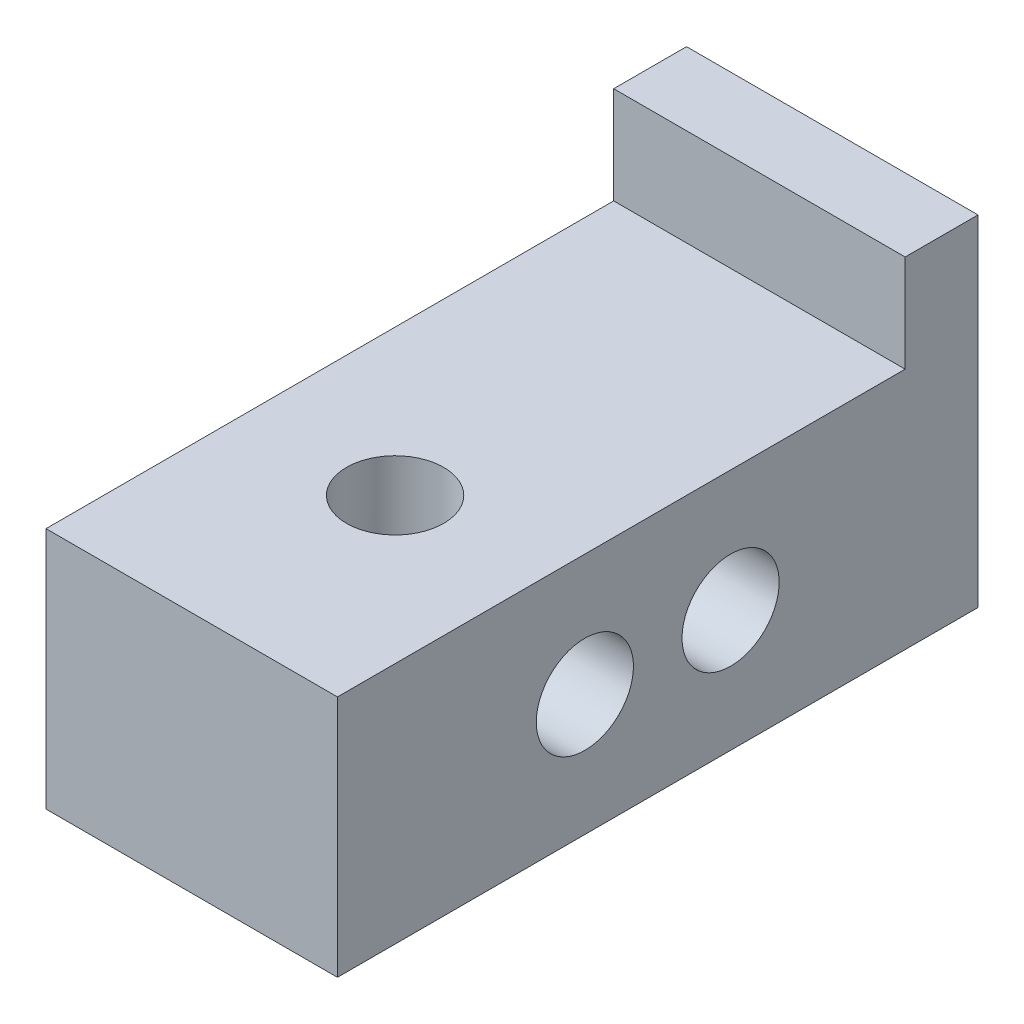
ISO-10303-21;
HEADER;
FILE_DESCRIPTION(('STEP AP214'),'2;1');
FILE_NAME('part.step','',(''),(''),'','','');
FILE_SCHEMA(('AUTOMOTIVE_DESIGN { 1 0 10303 214 1 1 1 1 }'));
ENDSEC;
DATA;
#1=APPLICATION_CONTEXT('core data for automotive mechanical design processes');
#2=APPLICATION_PROTOCOL_DEFINITION('international standard','automotive_design',2000,#1);
#3=PRODUCT_CONTEXT('',#1,'mechanical');
#4=PRODUCT('Part','Part','',(#3));
#5=PRODUCT_RELATED_PRODUCT_CATEGORY('part','',(#4));
#6=PRODUCT_DEFINITION_FORMATION('','',#4);
#7=PRODUCT_DEFINITION_CONTEXT('part definition',#1,'design');
#8=PRODUCT_DEFINITION('design','',#6,#7);
#9=PRODUCT_DEFINITION_SHAPE('','',#8);
#10=(LENGTH_UNIT() NAMED_UNIT(*) SI_UNIT(.MILLI.,.METRE.));
#11=(NAMED_UNIT(*) PLANE_ANGLE_UNIT() SI_UNIT($,.RADIAN.));
#12=(NAMED_UNIT(*) SI_UNIT($,.STERADIAN.) SOLID_ANGLE_UNIT());
#13=UNCERTAINTY_MEASURE_WITH_UNIT(LENGTH_MEASURE(1.E-05),#10,'distance_accuracy_value','');
#14=(GEOMETRIC_REPRESENTATION_CONTEXT(3) GLOBAL_UNCERTAINTY_ASSIGNED_CONTEXT((#13)) GLOBAL_UNIT_ASSIGNED_CONTEXT((#10,
#11,#12)) REPRESENTATION_CONTEXT('',''));
#15=CARTESIAN_POINT('',(0.,0.,0.));
#16=DIRECTION('',(0.,0.,1.));
#17=DIRECTION('',(1.,0.,0.));
#18=AXIS2_PLACEMENT_3D('',#15,#16,#17);
#19=CARTESIAN_POINT('',(0.,10.,0.));
#20=DIRECTION('',(0.,-1.,0.));
#21=DIRECTION('',(0.,0.,-1.));
#22=AXIS2_PLACEMENT_3D('',#19,#20,#21);
#23=PLANE('',#22);
#24=DIRECTION('',(0.,0.,-1.));
#25=VECTOR('',#24,1.);
#26=CARTESIAN_POINT('',(6.00000000000001,10.,8.37336111566911));
#27=LINE('',#26,#25);
#28=CARTESIAN_POINT('',(6.00000000000001,10.,8.37336111566911));
#29=VERTEX_POINT('',#28);
#30=CARTESIAN_POINT('',(6.00000000000001,10.,-15.));
#31=VERTEX_POINT('',#30);
#32=EDGE_CURVE('E108',#29,#31,#27,.T.);
#33=ORIENTED_EDGE('',*,*,#32,.T.);
#34=DIRECTION('',(-1.,0.,0.));
#35=VECTOR('',#34,1.);
#36=CARTESIAN_POINT('',(-6.,10.,-15.));
#37=LINE('',#36,#35);
#38=CARTESIAN_POINT('',(-6.,10.,-15.));
#39=VERTEX_POINT('',#38);
#40=EDGE_CURVE('E85',#31,#39,#37,.T.);
#41=ORIENTED_EDGE('',*,*,#40,.T.);
#42=DIRECTION('',(0.,0.,1.));
#43=VECTOR('',#42,1.);
#44=CARTESIAN_POINT('',(-6.,10.,-15.));
#45=LINE('',#44,#43);
#46=CARTESIAN_POINT('',(-6.,10.,8.37336111566911));
#47=VERTEX_POINT('',#46);
#48=EDGE_CURVE('E106',#39,#47,#45,.T.);
#49=ORIENTED_EDGE('',*,*,#48,.T.);
#50=DIRECTION('',(1.,0.,0.));
#51=VECTOR('',#50,1.);
#52=CARTESIAN_POINT('',(-6.,10.,8.37336111566911));
#53=LINE('',#52,#51);
#54=EDGE_CURVE('E64',#47,#29,#53,.T.);
#55=ORIENTED_EDGE('',*,*,#54,.T.);
#56=EDGE_LOOP('',(#33,#41,#49,#55));
#57=FACE_BOUND('',#56,.T.);
#58=CARTESIAN_POINT('',(0.,10.,0.));
#59=DIRECTION('',(0.,1.,0.));
#60=DIRECTION('',(0.,0.,1.));
#61=AXIS2_PLACEMENT_3D('',#58,#59,#60);
#62=CIRCLE('',#61,2.);
#63=CARTESIAN_POINT('',(0.,10.,2.));
#64=VERTEX_POINT('',#63);
#65=EDGE_CURVE('E122',#64,#64,#62,.T.);
#66=ORIENTED_EDGE('',*,*,#65,.F.);
#67=EDGE_LOOP('',(#66));
#68=FACE_BOUND('',#67,.T.);
#69=ADVANCED_FACE('F40',(#57,#68),#23,.F.);
#70=CARTESIAN_POINT('',(0.,0.,0.));
#71=DIRECTION('',(0.,-1.,0.));
#72=DIRECTION('',(0.,0.,-1.));
#73=AXIS2_PLACEMENT_3D('',#70,#71,#72);
#74=PLANE('',#73);
#75=DIRECTION('',(0.,0.,-1.));
#76=VECTOR('',#75,1.);
#77=CARTESIAN_POINT('',(6.00000000000001,0.,8.37336111566911));
#78=LINE('',#77,#76);
#79=CARTESIAN_POINT('',(6.00000000000001,0.,8.37336111566911));
#80=VERTEX_POINT('',#79);
#81=CARTESIAN_POINT('',(6.00000000000001,0.,-18.));
#82=VERTEX_POINT('',#81);
#83=EDGE_CURVE('E118',#80,#82,#78,.T.);
#84=ORIENTED_EDGE('',*,*,#83,.F.);
#85=DIRECTION('',(1.,0.,0.));
#86=VECTOR('',#85,1.);
#87=CARTESIAN_POINT('',(-6.,0.,8.37336111566911));
#88=LINE('',#87,#86);
#89=CARTESIAN_POINT('',(-6.,0.,8.37336111566911));
#90=VERTEX_POINT('',#89);
#91=EDGE_CURVE('E125',#90,#80,#88,.T.);
#92=ORIENTED_EDGE('',*,*,#91,.F.);
#93=DIRECTION('',(0.,0.,1.));
#94=VECTOR('',#93,1.);
#95=CARTESIAN_POINT('',(-6.,0.,-15.));
#96=LINE('',#95,#94);
#97=CARTESIAN_POINT('',(-6.,0.,-18.));
#98=VERTEX_POINT('',#97);
#99=EDGE_CURVE('E76',#98,#90,#96,.T.);
#100=ORIENTED_EDGE('',*,*,#99,.F.);
#101=DIRECTION('',(-1.,0.,0.));
#102=VECTOR('',#101,1.);
#103=CARTESIAN_POINT('',(-6.,0.,-18.));
#104=LINE('',#103,#102);
#105=EDGE_CURVE('E142',#82,#98,#104,.T.);
#106=ORIENTED_EDGE('',*,*,#105,.F.);
#107=EDGE_LOOP('',(#84,#92,#100,#106));
#108=FACE_BOUND('',#107,.T.);
#109=CARTESIAN_POINT('',(0.,0.,0.));
#110=DIRECTION('',(0.,1.,0.));
#111=DIRECTION('',(0.,0.,1.));
#112=AXIS2_PLACEMENT_3D('',#109,#110,#111);
#113=CIRCLE('',#112,2.);
#114=CARTESIAN_POINT('',(0.,0.,2.));
#115=VERTEX_POINT('',#114);
#116=EDGE_CURVE('E102',#115,#115,#113,.T.);
#117=ORIENTED_EDGE('',*,*,#116,.T.);
#118=EDGE_LOOP('',(#117));
#119=FACE_BOUND('',#118,.T.);
#120=ADVANCED_FACE('F139',(#108,#119),#74,.T.);
#121=CARTESIAN_POINT('',(6.00000000000001,10.,8.37336111566911));
#122=DIRECTION('',(-1.,0.,0.));
#123=DIRECTION('',(0.,0.,1.));
#124=AXIS2_PLACEMENT_3D('',#121,#122,#123);
#125=PLANE('',#124);
#126=CARTESIAN_POINT('',(6.,5.,-7.81331944216545));
#127=DIRECTION('',(-1.,0.,0.));
#128=DIRECTION('',(0.,0.,1.));
#129=AXIS2_PLACEMENT_3D('',#126,#127,#128);
#130=CIRCLE('',#129,2.);
#131=CARTESIAN_POINT('',(6.,5.,-5.81331944216545));
#132=VERTEX_POINT('',#131);
#133=EDGE_CURVE('E149',#132,#132,#130,.T.);
#134=ORIENTED_EDGE('',*,*,#133,.T.);
#135=EDGE_LOOP('',(#134));
#136=FACE_BOUND('',#135,.T.);
#137=CARTESIAN_POINT('',(6.,5.,-1.81331944216545));
#138=DIRECTION('',(-1.,0.,0.));
#139=DIRECTION('',(0.,0.,1.));
#140=AXIS2_PLACEMENT_3D('',#137,#138,#139);
#141=CIRCLE('',#140,2.);
#142=CARTESIAN_POINT('',(6.,5.,0.186680557834554));
#143=VERTEX_POINT('',#142);
#144=EDGE_CURVE('E155',#143,#143,#141,.T.);
#145=ORIENTED_EDGE('',*,*,#144,.T.);
#146=EDGE_LOOP('',(#145));
#147=FACE_BOUND('',#146,.T.);
#148=ORIENTED_EDGE('',*,*,#83,.T.);
#149=DIRECTION('',(0.,-1.,0.));
#150=VECTOR('',#149,1.);
#151=CARTESIAN_POINT('',(6.00000000000001,14.,-18.));
#152=LINE('',#151,#150);
#153=CARTESIAN_POINT('',(6.00000000000001,14.,-18.));
#154=VERTEX_POINT('',#153);
#155=EDGE_CURVE('E171',#154,#82,#152,.T.);
#156=ORIENTED_EDGE('',*,*,#155,.F.);
#157=DIRECTION('',(0.,0.,-1.));
#158=VECTOR('',#157,1.);
#159=CARTESIAN_POINT('',(6.00000000000001,14.,-15.));
#160=LINE('',#159,#158);
#161=CARTESIAN_POINT('',(6.00000000000001,14.,-15.));
#162=VERTEX_POINT('',#161);
#163=EDGE_CURVE('E161',#162,#154,#160,.T.);
#164=ORIENTED_EDGE('',*,*,#163,.F.);
#165=DIRECTION('',(0.,-1.,0.));
#166=VECTOR('',#165,1.);
#167=CARTESIAN_POINT('',(6.00000000000001,14.,-15.));
#168=LINE('',#167,#166);
#169=EDGE_CURVE('E103',#162,#31,#168,.T.);
#170=ORIENTED_EDGE('',*,*,#169,.T.);
#171=ORIENTED_EDGE('',*,*,#32,.F.);
#172=DIRECTION('',(0.,-1.,0.));
#173=VECTOR('',#172,1.);
#174=CARTESIAN_POINT('',(6.00000000000001,10.,8.37336111566911));
#175=LINE('',#174,#173);
#176=EDGE_CURVE('E56',#29,#80,#175,.T.);
#177=ORIENTED_EDGE('',*,*,#176,.T.);
#178=EDGE_LOOP('',(#148,#156,#164,#170,#171,#177));
#179=FACE_BOUND('',#178,.T.);
#180=ADVANCED_FACE('F42',(#136,#147,#179),#125,.F.);
#181=CARTESIAN_POINT('',(-6.,10.,-15.));
#182=DIRECTION('',(1.,0.,0.));
#183=DIRECTION('',(0.,0.,-1.));
#184=AXIS2_PLACEMENT_3D('',#181,#182,#183);
#185=PLANE('',#184);
#186=CARTESIAN_POINT('',(-6.,5.,-7.81331944216545));
#187=DIRECTION('',(-1.,0.,0.));
#188=DIRECTION('',(0.,0.,1.));
#189=AXIS2_PLACEMENT_3D('',#186,#187,#188);
#190=CIRCLE('',#189,2.);
#191=CARTESIAN_POINT('',(-6.,5.,-5.81331944216544));
#192=VERTEX_POINT('',#191);
#193=EDGE_CURVE('E214',#192,#192,#190,.T.);
#194=ORIENTED_EDGE('',*,*,#193,.F.);
#195=EDGE_LOOP('',(#194));
#196=FACE_BOUND('',#195,.T.);
#197=CARTESIAN_POINT('',(-6.,5.,-1.81331944216545));
#198=DIRECTION('',(-1.,0.,0.));
#199=DIRECTION('',(0.,0.,1.));
#200=AXIS2_PLACEMENT_3D('',#197,#198,#199);
#201=CIRCLE('',#200,2.);
#202=CARTESIAN_POINT('',(-6.,5.,0.186680557834556));
#203=VERTEX_POINT('',#202);
#204=EDGE_CURVE('E217',#203,#203,#201,.T.);
#205=ORIENTED_EDGE('',*,*,#204,.F.);
#206=EDGE_LOOP('',(#205));
#207=FACE_BOUND('',#206,.T.);
#208=ORIENTED_EDGE('',*,*,#99,.T.);
#209=DIRECTION('',(0.,-1.,0.));
#210=VECTOR('',#209,1.);
#211=CARTESIAN_POINT('',(-6.,10.,8.37336111566911));
#212=LINE('',#211,#210);
#213=EDGE_CURVE('E11',#47,#90,#212,.T.);
#214=ORIENTED_EDGE('',*,*,#213,.F.);
#215=ORIENTED_EDGE('',*,*,#48,.F.);
#216=DIRECTION('',(0.,-1.,0.));
#217=VECTOR('',#216,1.);
#218=CARTESIAN_POINT('',(-6.,14.,-15.));
#219=LINE('',#218,#217);
#220=CARTESIAN_POINT('',(-6.,14.,-15.));
#221=VERTEX_POINT('',#220);
#222=EDGE_CURVE('E93',#221,#39,#219,.T.);
#223=ORIENTED_EDGE('',*,*,#222,.F.);
#224=DIRECTION('',(0.,0.,1.));
#225=VECTOR('',#224,1.);
#226=CARTESIAN_POINT('',(-6.,14.,-15.));
#227=LINE('',#226,#225);
#228=CARTESIAN_POINT('',(-6.,14.,-18.));
#229=VERTEX_POINT('',#228);
#230=EDGE_CURVE('E148',#229,#221,#227,.T.);
#231=ORIENTED_EDGE('',*,*,#230,.F.);
#232=DIRECTION('',(0.,-1.,0.));
#233=VECTOR('',#232,1.);
#234=CARTESIAN_POINT('',(-6.,14.,-18.));
#235=LINE('',#234,#233);
#236=EDGE_CURVE('E168',#229,#98,#235,.T.);
#237=ORIENTED_EDGE('',*,*,#236,.T.);
#238=EDGE_LOOP('',(#208,#214,#215,#223,#231,#237));
#239=FACE_BOUND('',#238,.T.);
#240=ADVANCED_FACE('F111',(#196,#207,#239),#185,.F.);
#241=CARTESIAN_POINT('',(-6.,10.,8.37336111566911));
#242=DIRECTION('',(0.,0.,-1.));
#243=DIRECTION('',(-1.,0.,0.));
#244=AXIS2_PLACEMENT_3D('',#241,#242,#243);
#245=PLANE('',#244);
#246=ORIENTED_EDGE('',*,*,#91,.T.);
#247=ORIENTED_EDGE('',*,*,#176,.F.);
#248=ORIENTED_EDGE('',*,*,#54,.F.);
#249=ORIENTED_EDGE('',*,*,#213,.T.);
#250=EDGE_LOOP('',(#246,#247,#248,#249));
#251=FACE_BOUND('',#250,.T.);
#252=ADVANCED_FACE('F186',(#251),#245,.F.);
#253=CARTESIAN_POINT('',(0.,10.,0.));
#254=DIRECTION('',(0.,-1.,0.));
#255=DIRECTION('',(0.,0.,-1.));
#256=AXIS2_PLACEMENT_3D('',#253,#254,#255);
#257=CYLINDRICAL_SURFACE('',#256,2.);
#258=CARTESIAN_POINT('',(0.,6.99126853270135,-2.));
#259=CARTESIAN_POINT('',(-0.112143229086386,6.99126942308835,-1.99999934005024));
#260=CARTESIAN_POINT('',(-0.224291314512654,6.99222343560448,-1.99054496028743));
#261=CARTESIAN_POINT('',(-0.445439379954963,6.99520398681138,-1.95298908898448));
#262=CARTESIAN_POINT('',(-0.554438326887592,6.99723087334127,-1.92488154910743));
#263=CARTESIAN_POINT('',(-0.766266435904901,6.99999160623168,-1.85079573427145));
#264=CARTESIAN_POINT('',(-0.869091784540033,7.00072466116739,-1.80480654224218));
#265=CARTESIAN_POINT('',(-1.06561460225727,6.99730130861139,-1.69618063267274));
#266=CARTESIAN_POINT('',(-1.15931228994161,6.99314501824789,-1.63354431395571));
#267=CARTESIAN_POINT('',(-1.28939613321082,6.98010466330255,-1.52985198640311));
#268=CARTESIAN_POINT('',(-1.33053881254709,6.97473650065371,-1.49419377988196));
#269=CARTESIAN_POINT('',(-1.40954636623935,6.96128651657752,-1.41989839802572));
#270=CARTESIAN_POINT('',(-1.44741311648559,6.9532062612824,-1.38126295183266));
#271=CARTESIAN_POINT('',(-1.51949331728818,6.93384736513408,-1.30154643758386));
#272=CARTESIAN_POINT('',(-1.55371121354777,6.92257267904738,-1.26046844282697));
#273=CARTESIAN_POINT('',(-1.61824893760184,6.89640791425496,-1.17646996368034));
#274=CARTESIAN_POINT('',(-1.64856953704912,6.88151855293555,-1.13354984627703));
#275=CARTESIAN_POINT('',(-1.72550113948489,6.83558602615675,-1.01517323687524));
#276=CARTESIAN_POINT('',(-1.76811543481115,6.80063223518841,-0.938548471080379));
#277=CARTESIAN_POINT('',(-1.84094589521428,6.7182771921645,-0.78617652398999));
#278=CARTESIAN_POINT('',(-1.87116388326075,6.67087777201427,-0.710429215251065));
#279=CARTESIAN_POINT('',(-1.91842045098874,6.56865928163556,-0.569839569740616));
#280=CARTESIAN_POINT('',(-1.9363351363286,6.51476471590773,-0.504612090534075));
#281=CARTESIAN_POINT('',(-1.96445811490352,6.39817783716925,-0.380719498585895));
#282=CARTESIAN_POINT('',(-1.97466415726142,6.33548296085312,-0.322056306832658));
#283=CARTESIAN_POINT('',(-1.99002654164323,6.19689518997848,-0.20827557835165));
#284=CARTESIAN_POINT('',(-1.99466546821938,6.12032832397824,-0.153912232433168));
#285=CARTESIAN_POINT('',(-1.99980179077285,5.96022777211619,-0.0564002113243095));
#286=CARTESIAN_POINT('',(-2.00029671884074,5.87668996469367,-0.0132582337021736));
#287=CARTESIAN_POINT('',(-1.99935868726461,5.69238240154821,0.0660459454856754));
#288=CARTESIAN_POINT('',(-1.99764786181885,5.59083238933384,0.100401408154512));
#289=CARTESIAN_POINT('',(-1.99435132230936,5.38355036488834,0.152467182806228));
#290=CARTESIAN_POINT('',(-1.99276562862074,5.27781767578627,0.170174789135334));
#291=CARTESIAN_POINT('',(-1.99108036285,5.05937302186599,0.188952461597324));
#292=CARTESIAN_POINT('',(-1.99106128852216,4.94658147949519,0.189121451027664));
#293=CARTESIAN_POINT('',(-1.99273692259282,4.72257104825898,0.170533677008231));
#294=CARTESIAN_POINT('',(-1.99443197919848,4.61135248358157,0.151773068217112));
#295=CARTESIAN_POINT('',(-1.99789229958984,4.39384621228331,0.0959099786426279));
#296=CARTESIAN_POINT('',(-1.99965742212992,4.28754943671877,0.0588428312204764));
#297=CARTESIAN_POINT('',(-2.00025642220061,4.08261081368761,-0.0325893823976385));
#298=CARTESIAN_POINT('',(-1.99908932119186,3.98397153299823,-0.0869602178791545));
#299=CARTESIAN_POINT('',(-1.98980372275692,3.79806297628228,-0.210920542965283));
#300=CARTESIAN_POINT('',(-1.98174069939682,3.71070935076797,-0.280385292440097));
#301=CARTESIAN_POINT('',(-1.96121947516926,3.59000796903327,-0.393816405360437));
#302=CARTESIAN_POINT('',(-1.95297639165697,3.55150043115326,-0.433159517351158));
#303=CARTESIAN_POINT('',(-1.93316959533721,3.47822438407291,-0.51440017318011));
#304=CARTESIAN_POINT('',(-1.92160650796086,3.44345517233083,-0.556297234728692));
#305=CARTESIAN_POINT('',(-1.88440146349238,3.35299389249959,-0.674738617048756));
#306=CARTESIAN_POINT('',(-1.85474436758304,3.3015373854818,-0.753365756880023));
#307=CARTESIAN_POINT('',(-1.78205667474408,3.21224911605061,-0.91207058205304));
#308=CARTESIAN_POINT('',(-1.73903435199076,3.17440895519385,-0.99214734115591));
#309=CARTESIAN_POINT('',(-1.64546550748009,3.11532957944772,-1.13981734950308));
#310=CARTESIAN_POINT('',(-1.59637790175452,3.09267062419304,-1.2077786552308));
#311=CARTESIAN_POINT('',(-1.48868909472764,3.05605375959673,-1.33826958257073));
#312=CARTESIAN_POINT('',(-1.43008517406994,3.04209834288891,-1.40079764373016));
#313=CARTESIAN_POINT('',(-1.30160078776846,3.02045938850253,-1.52117259864821));
#314=CARTESIAN_POINT('',(-1.23130714729948,3.01311852455976,-1.57863737281421));
#315=CARTESIAN_POINT('',(-1.08334678740809,3.00351202793137,-1.68362827802946));
#316=CARTESIAN_POINT('',(-1.00567620990882,3.00124906635115,-1.73114916643155));
#317=CARTESIAN_POINT('',(-0.833094041548664,2.99943628799276,-1.82118660993606));
#318=CARTESIAN_POINT('',(-0.737301809526328,3.00031836196478,-1.8620288565727));
#319=CARTESIAN_POINT('',(-0.540549462251195,3.00303506151183,-1.92836639121723));
#320=CARTESIAN_POINT('',(-0.439587626403302,3.00487000611215,-1.95385653309569));
#321=CARTESIAN_POINT('',(-0.22682807690269,3.00774738061693,-1.99024733107834));
#322=CARTESIAN_POINT('',(-0.114802900875644,3.00871607562856,-1.99984193539623));
#323=CARTESIAN_POINT('',(0.109272388732855,3.0087465005827,-2.0001542413599));
#324=CARTESIAN_POINT('',(0.221322503501561,3.00780809895759,-1.99087064062786));
#325=CARTESIAN_POINT('',(0.442309868722156,3.00484653611863,-1.95369423731902));
#326=CARTESIAN_POINT('',(0.551246115610802,3.00282302924892,-1.92579550427534));
#327=CARTESIAN_POINT('',(0.76299266737637,3.00003922789283,-1.8521373197849));
#328=CARTESIAN_POINT('',(0.865799927180175,2.9992795563589,-1.80636907405653));
#329=CARTESIAN_POINT('',(1.06247773384838,3.00258463797968,-1.69816303274679));
#330=CARTESIAN_POINT('',(1.15633018986018,3.00665894291658,-1.63569242303538));
#331=CARTESIAN_POINT('',(1.33168990675237,3.02403571668867,-1.49636059293474));
#332=CARTESIAN_POINT('',(1.41321158976887,3.03732730167637,-1.4195164230461));
#333=CARTESIAN_POINT('',(1.55438628378654,3.07579300091699,-1.26254577599915));
#334=CARTESIAN_POINT('',(1.61533547133934,3.09981275145818,-1.18331005327784));
#335=CARTESIAN_POINT('',(1.72274217034047,3.16175783059254,-1.02060412679572));
#336=CARTESIAN_POINT('',(1.76921660880176,3.19966680308167,-0.937139002843473));
#337=CARTESIAN_POINT('',(1.84208317240704,3.28391638626736,-0.782937901814216));
#338=CARTESIAN_POINT('',(1.87036700160128,3.3283573301852,-0.712042573157596));
#339=CARTESIAN_POINT('',(1.91711349913346,3.42763514092549,-0.574422139998956));
#340=CARTESIAN_POINT('',(1.93557357223804,3.4824747496758,-0.507698141580695));
#341=CARTESIAN_POINT('',(1.96450907430664,3.60164467086497,-0.380758726628646));
#342=CARTESIAN_POINT('',(1.97494119148954,3.6660242602618,-0.32058009869103));
#343=CARTESIAN_POINT('',(1.98985077371978,3.80256326836846,-0.208971297490543));
#344=CARTESIAN_POINT('',(1.994325724364,3.87472595828949,-0.15754482632337));
#345=CARTESIAN_POINT('',(1.99984576646172,4.03545130137926,-0.0584077073827951));
#346=CARTESIAN_POINT('',(2.00034888032685,4.12491449766772,-0.0121260518690867));
#347=CARTESIAN_POINT('',(1.99928165406809,4.3097715391063,0.0664914068528636));
#348=CARTESIAN_POINT('',(1.99771028642188,4.40516830093451,0.0988202885123696));
#349=CARTESIAN_POINT('',(1.99445564259909,4.60999637083108,0.151422110759208));
#350=CARTESIAN_POINT('',(1.99277795376315,4.71984918793823,0.170071593364329));
#351=CARTESIAN_POINT('',(1.99108219855859,4.94113037366704,0.188896771196589));
#352=CARTESIAN_POINT('',(1.99106414264122,5.05255875220611,0.189072350087456));
#353=CARTESIAN_POINT('',(1.99270957682578,5.2750070954947,0.170853921899788));
#354=CARTESIAN_POINT('',(1.99438993288609,5.38601175683231,0.152273663697219));
#355=CARTESIAN_POINT('',(1.99784811541726,5.60337612097276,0.0967953413075789));
#356=CARTESIAN_POINT('',(1.99962598805628,5.70973358004288,0.0598885328510098));
#357=CARTESIAN_POINT('',(2.00027293033851,5.91520648455933,-0.0314529020115355));
#358=CARTESIAN_POINT('',(1.99913199799608,6.01429582803908,-0.0859472375438565));
#359=CARTESIAN_POINT('',(1.99218161552959,6.15475569780335,-0.179391401620958));
#360=CARTESIAN_POINT('',(1.98898928576881,6.20023017049522,-0.212505792599706));
#361=CARTESIAN_POINT('',(1.98028641391631,6.28808918067541,-0.282317832868189));
#362=CARTESIAN_POINT('',(1.97477724748032,6.33047553428621,-0.319013345901255));
#363=CARTESIAN_POINT('',(1.96126152715075,6.40952233624607,-0.393449661236913));
#364=CARTESIAN_POINT('',(1.95341022723537,6.44636990599871,-0.43101994623053));
#365=CARTESIAN_POINT('',(1.93468605680219,6.51663855715915,-0.508505086928383));
#366=CARTESIAN_POINT('',(1.92381498473593,6.55006166186905,-0.548418536016941));
#367=CARTESIAN_POINT('',(1.89866176058137,6.61319928566318,-0.630000549054835));
#368=CARTESIAN_POINT('',(1.88438334997467,6.64291781849739,-0.67166714688236));
#369=CARTESIAN_POINT('',(1.85212116344705,6.69848700177853,-0.756105250995548));
#370=CARTESIAN_POINT('',(1.83413802672765,6.72433831813614,-0.798876565564987));
#371=CARTESIAN_POINT('',(1.78015561197954,6.78894853432315,-0.915174446455055));
#372=CARTESIAN_POINT('',(1.74039572272263,6.82394987466102,-0.989114186556959));
#373=CARTESIAN_POINT('',(1.6494675964774,6.88283744614802,-1.13428560629056));
#374=CARTESIAN_POINT('',(1.59829774095205,6.90672209887706,-1.20551690004159));
#375=CARTESIAN_POINT('',(1.48783967060337,6.94419084744194,-1.33923615121773));
#376=CARTESIAN_POINT('',(1.42896220060226,6.95815158668132,-1.40196089431337));
#377=CARTESIAN_POINT('',(1.30296504253528,6.97924853581636,-1.51978063176156));
#378=CARTESIAN_POINT('',(1.23584266684691,6.98638251367025,-1.57487312568267));
#379=CARTESIAN_POINT('',(1.08664418118737,6.99647928180636,-1.6818360770285));
#380=CARTESIAN_POINT('',(1.00373635753519,6.99886499036407,-1.73259905647663));
#381=CARTESIAN_POINT('',(0.831404849762716,7.00047882634889,-1.82158956657505));
#382=CARTESIAN_POINT('',(0.741977157767441,6.99970499520239,-1.85980930590817));
#383=CARTESIAN_POINT('',(0.545872217658506,6.99708079135959,-1.9272237645459));
#384=CARTESIAN_POINT('',(0.438514918725363,6.99509690458446,-1.9544522396439));
#385=CARTESIAN_POINT('',(0.220773390992123,6.99219031703259,-1.99084102259003));
#386=CARTESIAN_POINT('',(0.110389048295688,6.99126765624207,-2.00000064962662));
#387=CARTESIAN_POINT('',(0.,6.99126853270135,-2.));
#388=B_SPLINE_CURVE_WITH_KNOTS('',3,(#258,#259,#260,#261,#262,#263,#264,#265,#266,#267,#268,
#269,#270,#271,#272,#273,#274,#275,#276,#277,#278,#279,#280,#281,#282,#283,#284,#285,#286,#287,
#288,#289,#290,#291,#292,#293,#294,#295,#296,#297,#298,#299,#300,#301,#302,#303,#304,#305,#306,
#307,#308,#309,#310,#311,#312,#313,#314,#315,#316,#317,#318,#319,#320,#321,#322,#323,#324,#325,
#326,#327,#328,#329,#330,#331,#332,#333,#334,#335,#336,#337,#338,#339,#340,#341,#342,#343,#344,
#345,#346,#347,#348,#349,#350,#351,#352,#353,#354,#355,#356,#357,#358,#359,#360,#361,#362,#363,
#364,#365,#366,#367,#368,#369,#370,#371,#372,#373,#374,#375,#376,#377,#378,#379,#380,#381,#382,
#383,#384,#385,#386,#387),.UNSPECIFIED.,.T.,.F.,(4,2,2,2,2,2,2,2,2,2,2,2,2,2,2,2,2,2,2,2,2,2,2,
2,2,2,2,2,2,2,2,2,2,2,2,2,2,2,2,2,2,2,2,2,2,2,2,2,2,2,2,2,2,2,2,2,2,2,2,2,2,2,2,2,4),(0.,
0.33604418995549,0.672197396409887,1.00855615350453,1.3449068530184,1.50883134328893,
1.67266133568127,1.83628938307465,1.99988498254711,2.28131482096996,2.56270325818353,
2.82106640340939,3.07950495997899,3.36045954546821,3.64158143825432,3.9618237658057,
4.28211813099698,4.61886043094261,4.95567115018697,5.29183431839399,5.62810968561311,
5.9617050683558,6.12845529456007,6.29517412850192,6.58888196947034,6.88240834222952,
7.14176503992664,7.40119598153711,7.67340165631109,7.94575048463896,8.25685348684963,
8.56806071493584,8.90375963766444,9.23948172052217,9.57531080986755,9.91130538250895,
10.2479649768386,10.5842277158775,10.8907629330978,11.196938325186,11.4606323659069,
11.7243960346054,11.9895729523616,12.2548617606423,12.5558152263064,12.8569178147533,
13.1896546793646,13.5223936393297,13.8584696219583,14.1947061130723,14.532096341387,
14.7009292006399,14.8696619541321,15.0290474451691,15.1883382155594,15.3474548726036,
15.5065440991299,15.7778496947447,16.0491938003613,16.3095923122906,16.570075933679,
16.8606517029263,17.1514076251291,17.4821828398288,17.8129705174861),.UNSPECIFIED.);
#389=CARTESIAN_POINT('',(0.,6.99126853270135,-2.));
#390=VERTEX_POINT('',#389);
#391=EDGE_CURVE('E44',#390,#390,#388,.T.);
#392=ORIENTED_EDGE('',*,*,#391,.F.);
#393=EDGE_LOOP('',(#392));
#394=FACE_BOUND('',#393,.T.);
#395=ORIENTED_EDGE('',*,*,#65,.T.);
#396=EDGE_LOOP('',(#395));
#397=FACE_BOUND('',#396,.T.);
#398=ORIENTED_EDGE('',*,*,#116,.F.);
#399=EDGE_LOOP('',(#398));
#400=FACE_BOUND('',#399,.T.);
#401=ADVANCED_FACE('F184',(#394,#397,#400),#257,.F.);
#402=CARTESIAN_POINT('',(-6.,14.,-15.));
#403=DIRECTION('',(0.,0.,-1.));
#404=DIRECTION('',(-1.,0.,0.));
#405=AXIS2_PLACEMENT_3D('',#402,#403,#404);
#406=PLANE('',#405);
#407=ORIENTED_EDGE('',*,*,#40,.F.);
#408=ORIENTED_EDGE('',*,*,#169,.F.);
#409=DIRECTION('',(1.,0.,0.));
#410=VECTOR('',#409,1.);
#411=CARTESIAN_POINT('',(-6.,14.,-15.));
#412=LINE('',#411,#410);
#413=EDGE_CURVE('E97',#221,#162,#412,.T.);
#414=ORIENTED_EDGE('',*,*,#413,.F.);
#415=ORIENTED_EDGE('',*,*,#222,.T.);
#416=EDGE_LOOP('',(#407,#408,#414,#415));
#417=FACE_BOUND('',#416,.T.);
#418=ADVANCED_FACE('F94',(#417),#406,.F.);
#419=CARTESIAN_POINT('',(-6.,14.,-18.));
#420=DIRECTION('',(0.,0.,1.));
#421=DIRECTION('',(1.,0.,0.));
#422=AXIS2_PLACEMENT_3D('',#419,#420,#421);
#423=PLANE('',#422);
#424=ORIENTED_EDGE('',*,*,#155,.T.);
#425=ORIENTED_EDGE('',*,*,#105,.T.);
#426=ORIENTED_EDGE('',*,*,#236,.F.);
#427=DIRECTION('',(-1.,0.,0.));
#428=VECTOR('',#427,1.);
#429=CARTESIAN_POINT('',(-6.,14.,-18.));
#430=LINE('',#429,#428);
#431=EDGE_CURVE('E165',#154,#229,#430,.T.);
#432=ORIENTED_EDGE('',*,*,#431,.F.);
#433=EDGE_LOOP('',(#424,#425,#426,#432));
#434=FACE_BOUND('',#433,.T.);
#435=ADVANCED_FACE('F193',(#434),#423,.F.);
#436=CARTESIAN_POINT('',(0.,14.,0.));
#437=DIRECTION('',(0.,-1.,0.));
#438=DIRECTION('',(0.,0.,-1.));
#439=AXIS2_PLACEMENT_3D('',#436,#437,#438);
#440=PLANE('',#439);
#441=ORIENTED_EDGE('',*,*,#230,.T.);
#442=ORIENTED_EDGE('',*,*,#413,.T.);
#443=ORIENTED_EDGE('',*,*,#163,.T.);
#444=ORIENTED_EDGE('',*,*,#431,.T.);
#445=EDGE_LOOP('',(#441,#442,#443,#444));
#446=FACE_BOUND('',#445,.T.);
#447=ADVANCED_FACE('F234',(#446),#440,.F.);
#448=CARTESIAN_POINT('',(8.,5.,-1.81331944216545));
#449=DIRECTION('',(-1.,0.,0.));
#450=DIRECTION('',(0.,0.,1.));
#451=AXIS2_PLACEMENT_3D('',#448,#449,#450);
#452=CYLINDRICAL_SURFACE('',#451,2.);
#453=ORIENTED_EDGE('',*,*,#204,.T.);
#454=EDGE_LOOP('',(#453));
#455=FACE_BOUND('',#454,.T.);
#456=ORIENTED_EDGE('',*,*,#391,.T.);
#457=EDGE_LOOP('',(#456));
#458=FACE_BOUND('',#457,.T.);
#459=ORIENTED_EDGE('',*,*,#144,.F.);
#460=EDGE_LOOP('',(#459));
#461=FACE_BOUND('',#460,.T.);
#462=ADVANCED_FACE('F230',(#455,#458,#461),#452,.F.);
#463=CARTESIAN_POINT('',(8.,5.,-7.81331944216545));
#464=DIRECTION('',(-1.,0.,0.));
#465=DIRECTION('',(0.,0.,1.));
#466=AXIS2_PLACEMENT_3D('',#463,#464,#465);
#467=CYLINDRICAL_SURFACE('',#466,2.);
#468=ORIENTED_EDGE('',*,*,#193,.T.);
#469=EDGE_LOOP('',(#468));
#470=FACE_BOUND('',#469,.T.);
#471=ORIENTED_EDGE('',*,*,#133,.F.);
#472=EDGE_LOOP('',(#471));
#473=FACE_BOUND('',#472,.T.);
#474=ADVANCED_FACE('F233',(#470,#473),#467,.F.);
#475=CLOSED_SHELL('',(#69,#120,#180,#240,#252,#401,#418,#435,#447,#462,#474));
#476=MANIFOLD_SOLID_BREP('B2',#475);
#477=ADVANCED_BREP_SHAPE_REPRESENTATION('',(#18,#476),#14);
#478=SHAPE_DEFINITION_REPRESENTATION(#9,#477);
ENDSEC;
END-ISO-10303-21;
